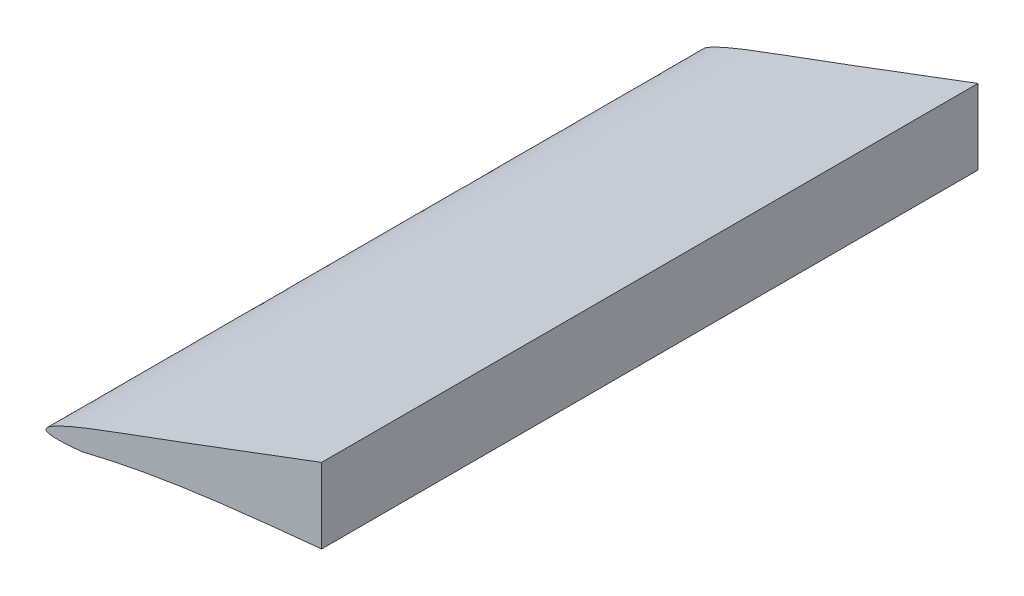
ISO-10303-21;
HEADER;
FILE_DESCRIPTION(('STEP AP214'),'2;1');
FILE_NAME('part.step','',(''),(''),'','','');
FILE_SCHEMA(('AUTOMOTIVE_DESIGN { 1 0 10303 214 1 1 1 1 }'));
ENDSEC;
DATA;
#1=APPLICATION_CONTEXT('core data for automotive mechanical design processes');
#2=APPLICATION_PROTOCOL_DEFINITION('international standard','automotive_design',2000,#1);
#3=PRODUCT_CONTEXT('',#1,'mechanical');
#4=PRODUCT('Part','Part','',(#3));
#5=PRODUCT_RELATED_PRODUCT_CATEGORY('part','',(#4));
#6=PRODUCT_DEFINITION_FORMATION('','',#4);
#7=PRODUCT_DEFINITION_CONTEXT('part definition',#1,'design');
#8=PRODUCT_DEFINITION('design','',#6,#7);
#9=PRODUCT_DEFINITION_SHAPE('','',#8);
#10=(LENGTH_UNIT() NAMED_UNIT(*) SI_UNIT(.MILLI.,.METRE.));
#11=(NAMED_UNIT(*) PLANE_ANGLE_UNIT() SI_UNIT($,.RADIAN.));
#12=(NAMED_UNIT(*) SI_UNIT($,.STERADIAN.) SOLID_ANGLE_UNIT());
#13=UNCERTAINTY_MEASURE_WITH_UNIT(LENGTH_MEASURE(1.E-05),#10,'distance_accuracy_value','');
#14=(GEOMETRIC_REPRESENTATION_CONTEXT(3) GLOBAL_UNCERTAINTY_ASSIGNED_CONTEXT((#13)) GLOBAL_UNIT_ASSIGNED_CONTEXT((#10,
#11,#12)) REPRESENTATION_CONTEXT('',''));
#15=CARTESIAN_POINT('',(0.,0.,0.));
#16=DIRECTION('',(0.,0.,1.));
#17=DIRECTION('',(1.,0.,0.));
#18=AXIS2_PLACEMENT_3D('',#15,#16,#17);
#19=CARTESIAN_POINT('',(-16.1561552730396,2.09294766279135,39.37));
#20=DIRECTION('',(0.,0.,-1.));
#21=DIRECTION('',(-1.,0.,0.));
#22=AXIS2_PLACEMENT_3D('',#19,#20,#21);
#23=PLANE('',#22);
#24=CARTESIAN_POINT('',(-43.5667543838989,-9.1185130579212,39.37));
#25=CARTESIAN_POINT('',(-37.677273053983,-7.64768793504535,39.37));
#26=CARTESIAN_POINT('',(-27.7099480334527,-7.0246558315263,39.37));
#27=CARTESIAN_POINT('',(-9.98446347913125,-4.60428644123773,39.37));
#28=CARTESIAN_POINT('',(5.43321469344664,-3.69122975094768,39.37));
#29=CARTESIAN_POINT('',(16.9241190082548,-2.5678275045766,39.37));
#30=CARTESIAN_POINT('',(20.5342933669863,-2.26556299643368,39.37));
#31=CARTESIAN_POINT('',(20.5680251074916,-2.26274319297277,39.37));
#32=B_SPLINE_CURVE_WITH_KNOTS('',3,(#24,#25,#26,#27,#28,#29,#30,#31),.UNSPECIFIED.,.F.,.F.,(4,1,
1,1,1,4),(0.794337024705572,0.852124105685605,0.889611915980359,0.965358143172667,
0.999676326512797,1.),.UNSPECIFIED.);
#33=CARTESIAN_POINT('',(-43.5667543838989,-9.1185130579212,39.37));
#34=VERTEX_POINT('',#33);
#35=CARTESIAN_POINT('',(-29.2099999940323,-6.98882011229367,39.37));
#36=VERTEX_POINT('',#35);
#37=EDGE_CURVE('E93',#34,#36,#32,.T.);
#38=ORIENTED_EDGE('',*,*,#37,.T.);
#39=DIRECTION('',(0.,-1.,0.));
#40=VECTOR('',#39,1.);
#41=CARTESIAN_POINT('',(-29.21,22.9785936714072,39.37));
#42=LINE('',#41,#40);
#43=CARTESIAN_POINT('',(-29.21,-2.48925403514962,39.37));
#44=VERTEX_POINT('',#43);
#45=EDGE_CURVE('E63',#44,#36,#42,.T.);
#46=ORIENTED_EDGE('',*,*,#45,.F.);
#47=CARTESIAN_POINT('',(17.8990724415791,12.3877846203547,39.37));
#48=CARTESIAN_POINT('',(11.7790167256047,10.6925023401997,39.37));
#49=CARTESIAN_POINT('',(-2.95857416787217,6.43186852529945,39.37));
#50=CARTESIAN_POINT('',(-24.0802781594164,-0.40764875453386,39.37));
#51=CARTESIAN_POINT('',(-34.9936382099448,-4.73581500625607,39.37));
#52=CARTESIAN_POINT('',(-48.5373587126558,-9.63484988657126,39.37));
#53=CARTESIAN_POINT('',(-43.5667543838989,-9.1185130579212,39.37));
#54=B_SPLINE_CURVE_WITH_KNOTS('',3,(#47,#48,#49,#50,#51,#52,#53),.UNSPECIFIED.,.F.,.F.,(4,1,1,1,
4),(0.,0.0562610280461275,0.13357871929437,0.17988097810211,0.203822749471509),.UNSPECIFIED.);
#55=EDGE_CURVE('E71',#44,#34,#54,.T.);
#56=ORIENTED_EDGE('',*,*,#55,.T.);
#57=EDGE_LOOP('',(#38,#46,#56));
#58=FACE_BOUND('',#57,.T.);
#59=ADVANCED_FACE('F43',(#58),#23,.F.);
#60=CARTESIAN_POINT('',(-16.1561552730396,2.09294766279135,0.));
#61=DIRECTION('',(0.,0.,-1.));
#62=DIRECTION('',(-1.,0.,0.));
#63=AXIS2_PLACEMENT_3D('',#60,#61,#62);
#64=PLANE('',#63);
#65=DIRECTION('',(0.,-1.,0.));
#66=VECTOR('',#65,1.);
#67=CARTESIAN_POINT('',(-29.21,22.9785936714072,0.));
#68=LINE('',#67,#66);
#69=CARTESIAN_POINT('',(-29.21,-2.48925403514962,0.));
#70=VERTEX_POINT('',#69);
#71=CARTESIAN_POINT('',(-29.21,-6.98882011229367,0.));
#72=VERTEX_POINT('',#71);
#73=EDGE_CURVE('E87',#70,#72,#68,.T.);
#74=ORIENTED_EDGE('',*,*,#73,.T.);
#75=CARTESIAN_POINT('',(-43.5667543838989,-9.1185130579212,0.));
#76=CARTESIAN_POINT('',(-37.677273053983,-7.64768793504535,0.));
#77=CARTESIAN_POINT('',(-27.7099480334527,-7.0246558315263,0.));
#78=CARTESIAN_POINT('',(-9.98446347913125,-4.60428644123773,0.));
#79=CARTESIAN_POINT('',(5.43321469344664,-3.69122975094768,0.));
#80=CARTESIAN_POINT('',(16.9241190082548,-2.5678275045766,0.));
#81=CARTESIAN_POINT('',(20.5342933669863,-2.26556299643368,0.));
#82=CARTESIAN_POINT('',(20.5680251074916,-2.26274319297277,0.));
#83=B_SPLINE_CURVE_WITH_KNOTS('',3,(#75,#76,#77,#78,#79,#80,#81,#82),.UNSPECIFIED.,.F.,.F.,(4,1,
1,1,1,4),(0.794337024705572,0.852124105685605,0.889611915980359,0.965358143172667,
0.999676326512797,1.),.UNSPECIFIED.);
#84=CARTESIAN_POINT('',(-43.5667543838989,-9.1185130579212,0.));
#85=VERTEX_POINT('',#84);
#86=EDGE_CURVE('E99',#85,#72,#83,.T.);
#87=ORIENTED_EDGE('',*,*,#86,.F.);
#88=CARTESIAN_POINT('',(17.8990724415791,12.3877846203547,0.));
#89=CARTESIAN_POINT('',(11.7790167256047,10.6925023401997,0.));
#90=CARTESIAN_POINT('',(-2.95857416787217,6.43186852529945,0.));
#91=CARTESIAN_POINT('',(-24.0802781594164,-0.40764875453386,0.));
#92=CARTESIAN_POINT('',(-34.9936382099448,-4.73581500625607,0.));
#93=CARTESIAN_POINT('',(-48.5373587126558,-9.63484988657126,0.));
#94=CARTESIAN_POINT('',(-43.5667543838989,-9.1185130579212,0.));
#95=B_SPLINE_CURVE_WITH_KNOTS('',3,(#88,#89,#90,#91,#92,#93,#94),.UNSPECIFIED.,.F.,.F.,(4,1,1,1,
4),(0.,0.0562610280461275,0.13357871929437,0.17988097810211,0.203822749471509),.UNSPECIFIED.);
#96=EDGE_CURVE('E91',#70,#85,#95,.T.);
#97=ORIENTED_EDGE('',*,*,#96,.F.);
#98=EDGE_LOOP('',(#74,#87,#97));
#99=FACE_BOUND('',#98,.T.);
#100=ADVANCED_FACE('F124',(#99),#64,.T.);
#101=DIRECTION('',(0.,0.,-1.));
#102=VECTOR('',#101,1.);
#103=SURFACE_OF_LINEAR_EXTRUSION('',#54,#102);
#104=ORIENTED_EDGE('',*,*,#55,.F.);
#105=DIRECTION('',(0.,0.,-1.));
#106=VECTOR('',#105,1.);
#107=CARTESIAN_POINT('',(-29.21,-2.48925403515118,39.37));
#108=LINE('',#107,#106);
#109=EDGE_CURVE('E84',#44,#70,#108,.T.);
#110=ORIENTED_EDGE('',*,*,#109,.T.);
#111=ORIENTED_EDGE('',*,*,#96,.T.);
#112=DIRECTION('',(0.,0.,-1.));
#113=VECTOR('',#112,1.);
#114=CARTESIAN_POINT('',(-43.5667543838989,-9.1185130579212,39.37));
#115=LINE('',#114,#113);
#116=EDGE_CURVE('E53',#34,#85,#115,.T.);
#117=ORIENTED_EDGE('',*,*,#116,.F.);
#118=EDGE_LOOP('',(#104,#110,#111,#117));
#119=FACE_BOUND('',#118,.T.);
#120=ADVANCED_FACE('F45',(#119),#103,.F.);
#121=DIRECTION('',(0.,0.,-1.));
#122=VECTOR('',#121,1.);
#123=SURFACE_OF_LINEAR_EXTRUSION('',#32,#122);
#124=ORIENTED_EDGE('',*,*,#86,.T.);
#125=DIRECTION('',(0.,0.,-1.));
#126=VECTOR('',#125,1.);
#127=CARTESIAN_POINT('',(-29.21,-6.98882011288114,39.37));
#128=LINE('',#127,#126);
#129=EDGE_CURVE('E11',#72,#36,#128,.F.);
#130=ORIENTED_EDGE('',*,*,#129,.T.);
#131=ORIENTED_EDGE('',*,*,#37,.F.);
#132=ORIENTED_EDGE('',*,*,#116,.T.);
#133=EDGE_LOOP('',(#124,#130,#131,#132));
#134=FACE_BOUND('',#133,.T.);
#135=ADVANCED_FACE('F120',(#134),#123,.F.);
#136=CARTESIAN_POINT('',(-29.21,22.9785936714072,0.));
#137=DIRECTION('',(-1.,0.,0.));
#138=DIRECTION('',(0.,-1.,0.));
#139=AXIS2_PLACEMENT_3D('',#136,#137,#138);
#140=PLANE('',#139);
#141=ORIENTED_EDGE('',*,*,#45,.T.);
#142=ORIENTED_EDGE('',*,*,#129,.F.);
#143=ORIENTED_EDGE('',*,*,#73,.F.);
#144=ORIENTED_EDGE('',*,*,#109,.F.);
#145=EDGE_LOOP('',(#141,#142,#143,#144));
#146=FACE_BOUND('',#145,.T.);
#147=ADVANCED_FACE('F85',(#146),#140,.F.);
#148=CLOSED_SHELL('',(#59,#100,#120,#135,#147));
#149=MANIFOLD_SOLID_BREP('B2',#148);
#150=ADVANCED_BREP_SHAPE_REPRESENTATION('',(#18,#149),#14);
#151=SHAPE_DEFINITION_REPRESENTATION(#9,#150);
ENDSEC;
END-ISO-10303-21;
